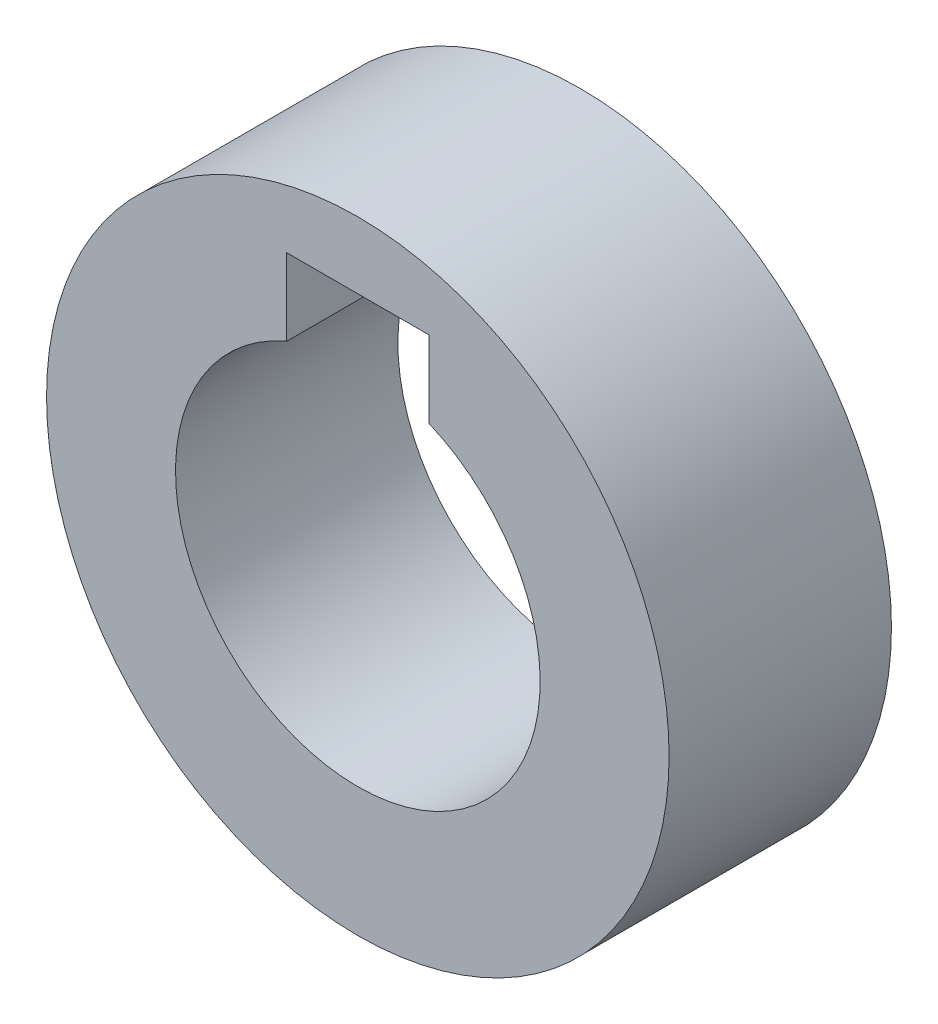
ISO-10303-21;
HEADER;
FILE_DESCRIPTION(('STEP AP214'),'2;1');
FILE_NAME('part.step','',(''),(''),'','','');
FILE_SCHEMA(('AUTOMOTIVE_DESIGN { 1 0 10303 214 1 1 1 1 }'));
ENDSEC;
DATA;
#1=APPLICATION_CONTEXT('core data for automotive mechanical design processes');
#2=APPLICATION_PROTOCOL_DEFINITION('international standard','automotive_design',2000,#1);
#3=PRODUCT_CONTEXT('',#1,'mechanical');
#4=PRODUCT('Part','Part','',(#3));
#5=PRODUCT_RELATED_PRODUCT_CATEGORY('part','',(#4));
#6=PRODUCT_DEFINITION_FORMATION('','',#4);
#7=PRODUCT_DEFINITION_CONTEXT('part definition',#1,'design');
#8=PRODUCT_DEFINITION('design','',#6,#7);
#9=PRODUCT_DEFINITION_SHAPE('','',#8);
#10=(LENGTH_UNIT() NAMED_UNIT(*) SI_UNIT(.MILLI.,.METRE.));
#11=(NAMED_UNIT(*) PLANE_ANGLE_UNIT() SI_UNIT($,.RADIAN.));
#12=(NAMED_UNIT(*) SI_UNIT($,.STERADIAN.) SOLID_ANGLE_UNIT());
#13=UNCERTAINTY_MEASURE_WITH_UNIT(LENGTH_MEASURE(1.E-05),#10,'distance_accuracy_value','');
#14=(GEOMETRIC_REPRESENTATION_CONTEXT(3) GLOBAL_UNCERTAINTY_ASSIGNED_CONTEXT((#13)) GLOBAL_UNIT_ASSIGNED_CONTEXT((#10,
#11,#12)) REPRESENTATION_CONTEXT('',''));
#15=CARTESIAN_POINT('',(0.,0.,0.));
#16=DIRECTION('',(0.,0.,1.));
#17=DIRECTION('',(1.,0.,0.));
#18=AXIS2_PLACEMENT_3D('',#15,#16,#17);
#19=CARTESIAN_POINT('',(0.,0.,5.));
#20=DIRECTION('',(0.,0.,1.));
#21=DIRECTION('',(1.,0.,0.));
#22=AXIS2_PLACEMENT_3D('',#19,#20,#21);
#23=PLANE('',#22);
#24=CARTESIAN_POINT('',(0.,0.,5.));
#25=DIRECTION('',(0.,0.,1.));
#26=DIRECTION('',(1.,0.,0.));
#27=AXIS2_PLACEMENT_3D('',#24,#25,#26);
#28=CIRCLE('',#27,7.);
#29=CARTESIAN_POINT('',(7.,0.,5.));
#30=VERTEX_POINT('',#29);
#31=EDGE_CURVE('E11',#30,#30,#28,.T.);
#32=ORIENTED_EDGE('',*,*,#31,.T.);
#33=EDGE_LOOP('',(#32));
#34=FACE_BOUND('',#33,.T.);
#35=DIRECTION('',(0.,1.,0.));
#36=VECTOR('',#35,1.);
#37=CARTESIAN_POINT('',(1.6,5.5,5.));
#38=LINE('',#37,#36);
#39=CARTESIAN_POINT('',(1.6,3.77491721763537,5.));
#40=VERTEX_POINT('',#39);
#41=CARTESIAN_POINT('',(1.6,5.5,5.));
#42=VERTEX_POINT('',#41);
#43=EDGE_CURVE('E82',#40,#42,#38,.T.);
#44=ORIENTED_EDGE('',*,*,#43,.F.);
#45=CARTESIAN_POINT('',(0.,0.,5.));
#46=DIRECTION('',(0.,0.,1.));
#47=DIRECTION('',(1.,0.,0.));
#48=AXIS2_PLACEMENT_3D('',#45,#46,#47);
#49=CIRCLE('',#48,4.1);
#50=CARTESIAN_POINT('',(-1.6,3.77491721763537,5.));
#51=VERTEX_POINT('',#50);
#52=EDGE_CURVE('E74',#51,#40,#49,.T.);
#53=ORIENTED_EDGE('',*,*,#52,.F.);
#54=DIRECTION('',(0.,-1.,0.));
#55=VECTOR('',#54,1.);
#56=CARTESIAN_POINT('',(-1.6,3.77491721763537,5.));
#57=LINE('',#56,#55);
#58=CARTESIAN_POINT('',(-1.6,5.5,5.));
#59=VERTEX_POINT('',#58);
#60=EDGE_CURVE('E95',#59,#51,#57,.T.);
#61=ORIENTED_EDGE('',*,*,#60,.F.);
#62=DIRECTION('',(-1.,0.,0.));
#63=VECTOR('',#62,1.);
#64=CARTESIAN_POINT('',(-1.6,5.5,5.));
#65=LINE('',#64,#63);
#66=EDGE_CURVE('E93',#42,#59,#65,.T.);
#67=ORIENTED_EDGE('',*,*,#66,.F.);
#68=EDGE_LOOP('',(#44,#53,#61,#67));
#69=FACE_BOUND('',#68,.T.);
#70=ADVANCED_FACE('F33',(#34,#69),#23,.T.);
#71=CARTESIAN_POINT('',(0.,0.,0.));
#72=DIRECTION('',(0.,0.,1.));
#73=DIRECTION('',(1.,0.,0.));
#74=AXIS2_PLACEMENT_3D('',#71,#72,#73);
#75=PLANE('',#74);
#76=CARTESIAN_POINT('',(0.,0.,0.));
#77=DIRECTION('',(0.,0.,1.));
#78=DIRECTION('',(1.,0.,0.));
#79=AXIS2_PLACEMENT_3D('',#76,#77,#78);
#80=CIRCLE('',#79,7.);
#81=CARTESIAN_POINT('',(7.,0.,0.));
#82=VERTEX_POINT('',#81);
#83=EDGE_CURVE('E37',#82,#82,#80,.T.);
#84=ORIENTED_EDGE('',*,*,#83,.F.);
#85=EDGE_LOOP('',(#84));
#86=FACE_BOUND('',#85,.T.);
#87=CARTESIAN_POINT('',(0.,0.,0.));
#88=DIRECTION('',(0.,0.,1.));
#89=DIRECTION('',(1.,0.,0.));
#90=AXIS2_PLACEMENT_3D('',#87,#88,#89);
#91=CIRCLE('',#90,4.1);
#92=CARTESIAN_POINT('',(-1.6,3.77491721763537,0.));
#93=VERTEX_POINT('',#92);
#94=CARTESIAN_POINT('',(1.6,3.77491721763537,0.));
#95=VERTEX_POINT('',#94);
#96=EDGE_CURVE('E56',#93,#95,#91,.T.);
#97=ORIENTED_EDGE('',*,*,#96,.T.);
#98=DIRECTION('',(0.,1.,0.));
#99=VECTOR('',#98,1.);
#100=CARTESIAN_POINT('',(1.6,5.5,0.));
#101=LINE('',#100,#99);
#102=CARTESIAN_POINT('',(1.6,5.5,0.));
#103=VERTEX_POINT('',#102);
#104=EDGE_CURVE('E89',#95,#103,#101,.T.);
#105=ORIENTED_EDGE('',*,*,#104,.T.);
#106=DIRECTION('',(-1.,0.,0.));
#107=VECTOR('',#106,1.);
#108=CARTESIAN_POINT('',(-1.6,5.5,0.));
#109=LINE('',#108,#107);
#110=CARTESIAN_POINT('',(-1.6,5.5,0.));
#111=VERTEX_POINT('',#110);
#112=EDGE_CURVE('E101',#103,#111,#109,.T.);
#113=ORIENTED_EDGE('',*,*,#112,.T.);
#114=DIRECTION('',(0.,-1.,0.));
#115=VECTOR('',#114,1.);
#116=CARTESIAN_POINT('',(-1.6,3.77491721763537,0.));
#117=LINE('',#116,#115);
#118=EDGE_CURVE('E83',#111,#93,#117,.T.);
#119=ORIENTED_EDGE('',*,*,#118,.T.);
#120=EDGE_LOOP('',(#97,#105,#113,#119));
#121=FACE_BOUND('',#120,.T.);
#122=ADVANCED_FACE('F112',(#86,#121),#75,.F.);
#123=CARTESIAN_POINT('',(0.,0.,5.));
#124=DIRECTION('',(0.,0.,-1.));
#125=DIRECTION('',(-1.,0.,0.));
#126=AXIS2_PLACEMENT_3D('',#123,#124,#125);
#127=CYLINDRICAL_SURFACE('',#126,7.);
#128=ORIENTED_EDGE('',*,*,#31,.F.);
#129=EDGE_LOOP('',(#128));
#130=FACE_BOUND('',#129,.T.);
#131=ORIENTED_EDGE('',*,*,#83,.T.);
#132=EDGE_LOOP('',(#131));
#133=FACE_BOUND('',#132,.T.);
#134=ADVANCED_FACE('F35',(#130,#133),#127,.T.);
#135=CARTESIAN_POINT('',(0.,0.,5.));
#136=DIRECTION('',(0.,0.,-1.));
#137=DIRECTION('',(-1.,0.,0.));
#138=AXIS2_PLACEMENT_3D('',#135,#136,#137);
#139=CYLINDRICAL_SURFACE('',#138,4.1);
#140=ORIENTED_EDGE('',*,*,#96,.F.);
#141=DIRECTION('',(0.,0.,-1.));
#142=VECTOR('',#141,1.);
#143=CARTESIAN_POINT('',(-1.6,3.77491721763537,5.));
#144=LINE('',#143,#142);
#145=EDGE_CURVE('E78',#51,#93,#144,.T.);
#146=ORIENTED_EDGE('',*,*,#145,.F.);
#147=ORIENTED_EDGE('',*,*,#52,.T.);
#148=DIRECTION('',(0.,0.,-1.));
#149=VECTOR('',#148,1.);
#150=CARTESIAN_POINT('',(1.6,3.77491721763537,5.));
#151=LINE('',#150,#149);
#152=EDGE_CURVE('E77',#40,#95,#151,.T.);
#153=ORIENTED_EDGE('',*,*,#152,.T.);
#154=EDGE_LOOP('',(#140,#146,#147,#153));
#155=FACE_BOUND('',#154,.T.);
#156=ADVANCED_FACE('F76',(#155),#139,.F.);
#157=CARTESIAN_POINT('',(1.6,5.5,5.));
#158=DIRECTION('',(-1.,0.,0.));
#159=DIRECTION('',(0.,0.,1.));
#160=AXIS2_PLACEMENT_3D('',#157,#158,#159);
#161=PLANE('',#160);
#162=ORIENTED_EDGE('',*,*,#104,.F.);
#163=ORIENTED_EDGE('',*,*,#152,.F.);
#164=ORIENTED_EDGE('',*,*,#43,.T.);
#165=DIRECTION('',(0.,0.,-1.));
#166=VECTOR('',#165,1.);
#167=CARTESIAN_POINT('',(1.6,5.5,5.));
#168=LINE('',#167,#166);
#169=EDGE_CURVE('E90',#42,#103,#168,.T.);
#170=ORIENTED_EDGE('',*,*,#169,.T.);
#171=EDGE_LOOP('',(#162,#163,#164,#170));
#172=FACE_BOUND('',#171,.T.);
#173=ADVANCED_FACE('F86',(#172),#161,.T.);
#174=CARTESIAN_POINT('',(-1.6,5.5,5.));
#175=DIRECTION('',(0.,-1.,0.));
#176=DIRECTION('',(0.,0.,-1.));
#177=AXIS2_PLACEMENT_3D('',#174,#175,#176);
#178=PLANE('',#177);
#179=ORIENTED_EDGE('',*,*,#112,.F.);
#180=ORIENTED_EDGE('',*,*,#169,.F.);
#181=ORIENTED_EDGE('',*,*,#66,.T.);
#182=DIRECTION('',(0.,0.,-1.));
#183=VECTOR('',#182,1.);
#184=CARTESIAN_POINT('',(-1.6,5.5,5.));
#185=LINE('',#184,#183);
#186=EDGE_CURVE('E48',#59,#111,#185,.T.);
#187=ORIENTED_EDGE('',*,*,#186,.T.);
#188=EDGE_LOOP('',(#179,#180,#181,#187));
#189=FACE_BOUND('',#188,.T.);
#190=ADVANCED_FACE('F110',(#189),#178,.T.);
#191=CARTESIAN_POINT('',(-1.6,3.77491721763537,5.));
#192=DIRECTION('',(1.,0.,0.));
#193=DIRECTION('',(0.,0.,-1.));
#194=AXIS2_PLACEMENT_3D('',#191,#192,#193);
#195=PLANE('',#194);
#196=ORIENTED_EDGE('',*,*,#118,.F.);
#197=ORIENTED_EDGE('',*,*,#186,.F.);
#198=ORIENTED_EDGE('',*,*,#60,.T.);
#199=ORIENTED_EDGE('',*,*,#145,.T.);
#200=EDGE_LOOP('',(#196,#197,#198,#199));
#201=FACE_BOUND('',#200,.T.);
#202=ADVANCED_FACE('F113',(#201),#195,.T.);
#203=CLOSED_SHELL('',(#70,#122,#134,#156,#173,#190,#202));
#204=MANIFOLD_SOLID_BREP('B2',#203);
#205=ADVANCED_BREP_SHAPE_REPRESENTATION('',(#18,#204),#14);
#206=SHAPE_DEFINITION_REPRESENTATION(#9,#205);
ENDSEC;
END-ISO-10303-21;
